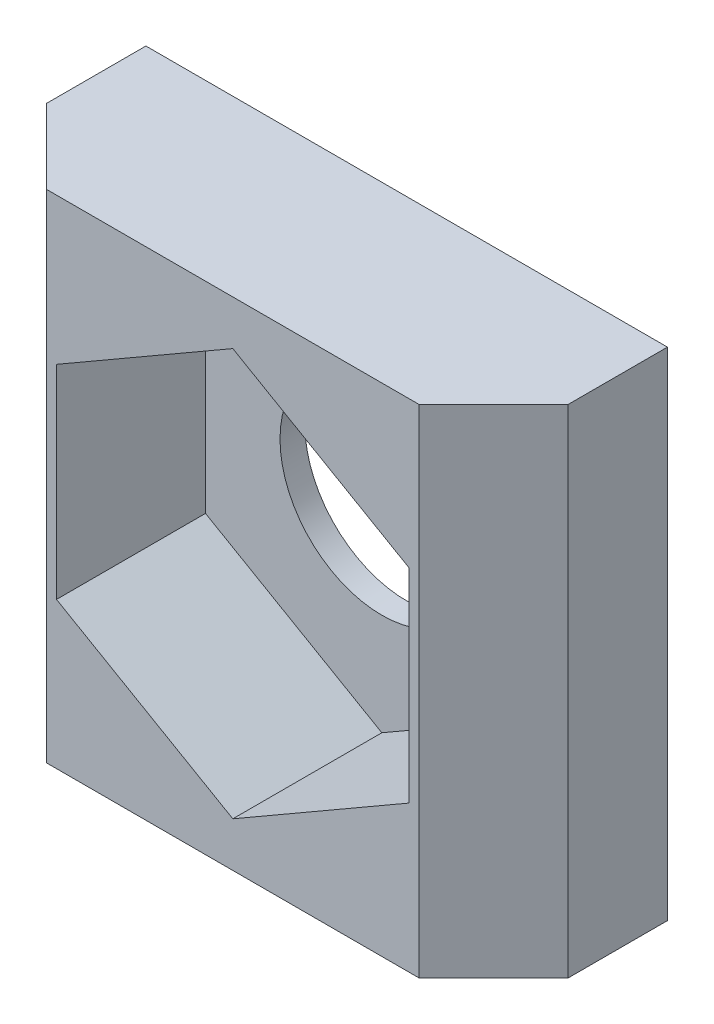
ISO-10303-21;
HEADER;
FILE_DESCRIPTION(('STEP AP214'),'2;1');
FILE_NAME('part.step','',(''),(''),'','','');
FILE_SCHEMA(('AUTOMOTIVE_DESIGN { 1 0 10303 214 1 1 1 1 }'));
ENDSEC;
DATA;
#1=APPLICATION_CONTEXT('core data for automotive mechanical design processes');
#2=APPLICATION_PROTOCOL_DEFINITION('international standard','automotive_design',2000,#1);
#3=PRODUCT_CONTEXT('',#1,'mechanical');
#4=PRODUCT('Part','Part','',(#3));
#5=PRODUCT_RELATED_PRODUCT_CATEGORY('part','',(#4));
#6=PRODUCT_DEFINITION_FORMATION('','',#4);
#7=PRODUCT_DEFINITION_CONTEXT('part definition',#1,'design');
#8=PRODUCT_DEFINITION('design','',#6,#7);
#9=PRODUCT_DEFINITION_SHAPE('','',#8);
#10=(LENGTH_UNIT() NAMED_UNIT(*) SI_UNIT(.MILLI.,.METRE.));
#11=(NAMED_UNIT(*) PLANE_ANGLE_UNIT() SI_UNIT($,.RADIAN.));
#12=(NAMED_UNIT(*) SI_UNIT($,.STERADIAN.) SOLID_ANGLE_UNIT());
#13=UNCERTAINTY_MEASURE_WITH_UNIT(LENGTH_MEASURE(1.E-05),#10,'distance_accuracy_value','');
#14=(GEOMETRIC_REPRESENTATION_CONTEXT(3) GLOBAL_UNCERTAINTY_ASSIGNED_CONTEXT((#13)) GLOBAL_UNIT_ASSIGNED_CONTEXT((#10,
#11,#12)) REPRESENTATION_CONTEXT('',''));
#15=CARTESIAN_POINT('',(0.,0.,0.));
#16=DIRECTION('',(0.,0.,1.));
#17=DIRECTION('',(1.,0.,0.));
#18=AXIS2_PLACEMENT_3D('',#15,#16,#17);
#19=CARTESIAN_POINT('',(5.25,10.,-1.5));
#20=DIRECTION('',(-1.,0.,0.));
#21=DIRECTION('',(0.,0.,1.));
#22=AXIS2_PLACEMENT_3D('',#19,#20,#21);
#23=PLANE('',#22);
#24=DIRECTION('',(0.,0.,-1.));
#25=VECTOR('',#24,1.);
#26=CARTESIAN_POINT('',(5.25,0.,-1.5));
#27=LINE('',#26,#25);
#28=CARTESIAN_POINT('',(5.25,0.,-1.5));
#29=VERTEX_POINT('',#28);
#30=CARTESIAN_POINT('',(5.25,0.,-3.5));
#31=VERTEX_POINT('',#30);
#32=EDGE_CURVE('E132',#29,#31,#27,.T.);
#33=ORIENTED_EDGE('',*,*,#32,.T.);
#34=DIRECTION('',(0.,-1.,0.));
#35=VECTOR('',#34,1.);
#36=CARTESIAN_POINT('',(5.25,10.,-3.5));
#37=LINE('',#36,#35);
#38=CARTESIAN_POINT('',(5.25,10.,-3.5));
#39=VERTEX_POINT('',#38);
#40=EDGE_CURVE('E11',#39,#31,#37,.T.);
#41=ORIENTED_EDGE('',*,*,#40,.F.);
#42=DIRECTION('',(0.,0.,-1.));
#43=VECTOR('',#42,1.);
#44=CARTESIAN_POINT('',(5.25,10.,-1.5));
#45=LINE('',#44,#43);
#46=CARTESIAN_POINT('',(5.25,10.,-1.5));
#47=VERTEX_POINT('',#46);
#48=EDGE_CURVE('E144',#47,#39,#45,.T.);
#49=ORIENTED_EDGE('',*,*,#48,.F.);
#50=DIRECTION('',(0.,-1.,0.));
#51=VECTOR('',#50,1.);
#52=CARTESIAN_POINT('',(5.25,10.,-1.5));
#53=LINE('',#52,#51);
#54=EDGE_CURVE('E128',#47,#29,#53,.T.);
#55=ORIENTED_EDGE('',*,*,#54,.T.);
#56=EDGE_LOOP('',(#33,#41,#49,#55));
#57=FACE_BOUND('',#56,.T.);
#58=ADVANCED_FACE('F35',(#57),#23,.F.);
#59=CARTESIAN_POINT('',(-5.25,10.,-3.5));
#60=DIRECTION('',(0.,0.,1.));
#61=DIRECTION('',(1.,0.,0.));
#62=AXIS2_PLACEMENT_3D('',#59,#60,#61);
#63=PLANE('',#62);
#64=CARTESIAN_POINT('',(0.,5.,-3.5));
#65=DIRECTION('',(0.,0.,-1.));
#66=DIRECTION('',(-1.,0.,0.));
#67=AXIS2_PLACEMENT_3D('',#64,#65,#66);
#68=CIRCLE('',#67,2.05);
#69=CARTESIAN_POINT('',(-2.05,5.,-3.5));
#70=VERTEX_POINT('',#69);
#71=EDGE_CURVE('E211',#70,#70,#68,.T.);
#72=ORIENTED_EDGE('',*,*,#71,.F.);
#73=EDGE_LOOP('',(#72));
#74=FACE_BOUND('',#73,.T.);
#75=DIRECTION('',(-1.,0.,0.));
#76=VECTOR('',#75,1.);
#77=CARTESIAN_POINT('',(-5.25,0.,-3.5));
#78=LINE('',#77,#76);
#79=CARTESIAN_POINT('',(-5.25,0.,-3.5));
#80=VERTEX_POINT('',#79);
#81=EDGE_CURVE('E135',#31,#80,#78,.T.);
#82=ORIENTED_EDGE('',*,*,#81,.T.);
#83=DIRECTION('',(0.,-1.,0.));
#84=VECTOR('',#83,1.);
#85=CARTESIAN_POINT('',(-5.25,10.,-3.5));
#86=LINE('',#85,#84);
#87=CARTESIAN_POINT('',(-5.25,10.,-3.5));
#88=VERTEX_POINT('',#87);
#89=EDGE_CURVE('E43',#88,#80,#86,.T.);
#90=ORIENTED_EDGE('',*,*,#89,.F.);
#91=DIRECTION('',(-1.,0.,0.));
#92=VECTOR('',#91,1.);
#93=CARTESIAN_POINT('',(-5.25,10.,-3.5));
#94=LINE('',#93,#92);
#95=EDGE_CURVE('E94',#39,#88,#94,.T.);
#96=ORIENTED_EDGE('',*,*,#95,.F.);
#97=ORIENTED_EDGE('',*,*,#40,.T.);
#98=EDGE_LOOP('',(#82,#90,#96,#97));
#99=FACE_BOUND('',#98,.T.);
#100=ADVANCED_FACE('F279',(#74,#99),#63,.F.);
#101=CARTESIAN_POINT('',(-5.25,10.,-1.5));
#102=DIRECTION('',(1.,0.,0.));
#103=DIRECTION('',(0.,0.,-1.));
#104=AXIS2_PLACEMENT_3D('',#101,#102,#103);
#105=PLANE('',#104);
#106=DIRECTION('',(0.,0.,1.));
#107=VECTOR('',#106,1.);
#108=CARTESIAN_POINT('',(-5.25,0.,-1.5));
#109=LINE('',#108,#107);
#110=CARTESIAN_POINT('',(-5.25,0.,-1.5));
#111=VERTEX_POINT('',#110);
#112=EDGE_CURVE('E138',#80,#111,#109,.T.);
#113=ORIENTED_EDGE('',*,*,#112,.T.);
#114=DIRECTION('',(0.,-1.,0.));
#115=VECTOR('',#114,1.);
#116=CARTESIAN_POINT('',(-5.25,10.,-1.5));
#117=LINE('',#116,#115);
#118=CARTESIAN_POINT('',(-5.25,10.,-1.5));
#119=VERTEX_POINT('',#118);
#120=EDGE_CURVE('E123',#119,#111,#117,.T.);
#121=ORIENTED_EDGE('',*,*,#120,.F.);
#122=DIRECTION('',(0.,0.,1.));
#123=VECTOR('',#122,1.);
#124=CARTESIAN_POINT('',(-5.25,10.,-1.5));
#125=LINE('',#124,#123);
#126=EDGE_CURVE('E111',#88,#119,#125,.T.);
#127=ORIENTED_EDGE('',*,*,#126,.F.);
#128=ORIENTED_EDGE('',*,*,#89,.T.);
#129=EDGE_LOOP('',(#113,#121,#127,#128));
#130=FACE_BOUND('',#129,.T.);
#131=ADVANCED_FACE('F151',(#130),#105,.F.);
#132=CARTESIAN_POINT('',(-3.75,10.,0.));
#133=DIRECTION('',(0.707106781186548,0.,-0.707106781186547));
#134=DIRECTION('',(-0.707106781186547,0.,-0.707106781186548));
#135=AXIS2_PLACEMENT_3D('',#132,#133,#134);
#136=PLANE('',#135);
#137=DIRECTION('',(0.707106781186547,0.,0.707106781186548));
#138=VECTOR('',#137,1.);
#139=CARTESIAN_POINT('',(-3.75,0.,0.));
#140=LINE('',#139,#138);
#141=CARTESIAN_POINT('',(-3.75,0.,0.));
#142=VERTEX_POINT('',#141);
#143=EDGE_CURVE('E120',#111,#142,#140,.T.);
#144=ORIENTED_EDGE('',*,*,#143,.T.);
#145=DIRECTION('',(0.,-1.,0.));
#146=VECTOR('',#145,1.);
#147=CARTESIAN_POINT('',(-3.75,10.,0.));
#148=LINE('',#147,#146);
#149=CARTESIAN_POINT('',(-3.75,10.,0.));
#150=VERTEX_POINT('',#149);
#151=EDGE_CURVE('E117',#150,#142,#148,.T.);
#152=ORIENTED_EDGE('',*,*,#151,.F.);
#153=DIRECTION('',(0.707106781186547,0.,0.707106781186548));
#154=VECTOR('',#153,1.);
#155=CARTESIAN_POINT('',(-3.75,10.,0.));
#156=LINE('',#155,#154);
#157=EDGE_CURVE('E104',#119,#150,#156,.T.);
#158=ORIENTED_EDGE('',*,*,#157,.F.);
#159=ORIENTED_EDGE('',*,*,#120,.T.);
#160=EDGE_LOOP('',(#144,#152,#158,#159));
#161=FACE_BOUND('',#160,.T.);
#162=ADVANCED_FACE('F118',(#161),#136,.F.);
#163=CARTESIAN_POINT('',(3.75,10.,0.));
#164=DIRECTION('',(0.,0.,-1.));
#165=DIRECTION('',(-1.,0.,0.));
#166=AXIS2_PLACEMENT_3D('',#163,#164,#165);
#167=PLANE('',#166);
#168=DIRECTION('',(-0.866025403784439,0.5,0.));
#169=VECTOR('',#168,1.);
#170=CARTESIAN_POINT('',(3.9400635094611,6.82439018343476,0.));
#171=LINE('',#170,#169);
#172=CARTESIAN_POINT('',(3.55,7.04959345562317,0.));
#173=VERTEX_POINT('',#172);
#174=CARTESIAN_POINT('',(0.,9.09918691124634,0.));
#175=VERTEX_POINT('',#174);
#176=EDGE_CURVE('E191',#173,#175,#171,.T.);
#177=ORIENTED_EDGE('',*,*,#176,.F.);
#178=DIRECTION('',(0.,1.,0.));
#179=VECTOR('',#178,1.);
#180=CARTESIAN_POINT('',(3.55,0.,0.));
#181=LINE('',#180,#179);
#182=CARTESIAN_POINT('',(3.55,2.95040654437683,0.));
#183=VERTEX_POINT('',#182);
#184=EDGE_CURVE('E50',#183,#173,#181,.T.);
#185=ORIENTED_EDGE('',*,*,#184,.F.);
#186=DIRECTION('',(0.866025403784439,0.5,0.));
#187=VECTOR('',#186,1.);
#188=CARTESIAN_POINT('',(-0.390063509461097,0.675609816565243,0.));
#189=LINE('',#188,#187);
#190=CARTESIAN_POINT('',(0.,0.900813088753658,0.));
#191=VERTEX_POINT('',#190);
#192=EDGE_CURVE('E178',#191,#183,#189,.T.);
#193=ORIENTED_EDGE('',*,*,#192,.F.);
#194=DIRECTION('',(0.866025403784439,-0.5,0.));
#195=VECTOR('',#194,1.);
#196=CARTESIAN_POINT('',(0.390063509461097,0.675609816565243,0.));
#197=LINE('',#196,#195);
#198=CARTESIAN_POINT('',(-3.55,2.95040654437683,0.));
#199=VERTEX_POINT('',#198);
#200=EDGE_CURVE('E182',#199,#191,#197,.T.);
#201=ORIENTED_EDGE('',*,*,#200,.F.);
#202=DIRECTION('',(0.,-1.,0.));
#203=VECTOR('',#202,1.);
#204=CARTESIAN_POINT('',(-3.55,0.,0.));
#205=LINE('',#204,#203);
#206=CARTESIAN_POINT('',(-3.55,7.04959345562317,0.));
#207=VERTEX_POINT('',#206);
#208=EDGE_CURVE('E185',#207,#199,#205,.T.);
#209=ORIENTED_EDGE('',*,*,#208,.F.);
#210=DIRECTION('',(-0.866025403784438,-0.5,0.));
#211=VECTOR('',#210,1.);
#212=CARTESIAN_POINT('',(-3.9400635094611,6.82439018343475,0.));
#213=LINE('',#212,#211);
#214=EDGE_CURVE('E188',#175,#207,#213,.T.);
#215=ORIENTED_EDGE('',*,*,#214,.F.);
#216=EDGE_LOOP('',(#177,#185,#193,#201,#209,#215));
#217=FACE_BOUND('',#216,.T.);
#218=DIRECTION('',(1.,0.,0.));
#219=VECTOR('',#218,1.);
#220=CARTESIAN_POINT('',(3.75,0.,0.));
#221=LINE('',#220,#219);
#222=CARTESIAN_POINT('',(3.75,0.,0.));
#223=VERTEX_POINT('',#222);
#224=EDGE_CURVE('E141',#142,#223,#221,.T.);
#225=ORIENTED_EDGE('',*,*,#224,.T.);
#226=DIRECTION('',(0.,-1.,0.));
#227=VECTOR('',#226,1.);
#228=CARTESIAN_POINT('',(3.75,10.,0.));
#229=LINE('',#228,#227);
#230=CARTESIAN_POINT('',(3.75,10.,0.));
#231=VERTEX_POINT('',#230);
#232=EDGE_CURVE('E124',#231,#223,#229,.T.);
#233=ORIENTED_EDGE('',*,*,#232,.F.);
#234=DIRECTION('',(1.,0.,0.));
#235=VECTOR('',#234,1.);
#236=CARTESIAN_POINT('',(3.75,10.,0.));
#237=LINE('',#236,#235);
#238=EDGE_CURVE('E108',#150,#231,#237,.T.);
#239=ORIENTED_EDGE('',*,*,#238,.F.);
#240=ORIENTED_EDGE('',*,*,#151,.T.);
#241=EDGE_LOOP('',(#225,#233,#239,#240));
#242=FACE_BOUND('',#241,.T.);
#243=ADVANCED_FACE('F126',(#217,#242),#167,.F.);
#244=CARTESIAN_POINT('',(3.75,10.,0.));
#245=DIRECTION('',(-0.707106781186548,0.,-0.707106781186547));
#246=DIRECTION('',(-0.707106781186547,0.,0.707106781186548));
#247=AXIS2_PLACEMENT_3D('',#244,#245,#246);
#248=PLANE('',#247);
#249=DIRECTION('',(0.707106781186547,0.,-0.707106781186548));
#250=VECTOR('',#249,1.);
#251=CARTESIAN_POINT('',(3.75,0.,0.));
#252=LINE('',#251,#250);
#253=EDGE_CURVE('E86',#223,#29,#252,.T.);
#254=ORIENTED_EDGE('',*,*,#253,.T.);
#255=ORIENTED_EDGE('',*,*,#54,.F.);
#256=DIRECTION('',(0.707106781186547,0.,-0.707106781186548));
#257=VECTOR('',#256,1.);
#258=CARTESIAN_POINT('',(3.75,10.,0.));
#259=LINE('',#258,#257);
#260=EDGE_CURVE('E59',#231,#47,#259,.T.);
#261=ORIENTED_EDGE('',*,*,#260,.F.);
#262=ORIENTED_EDGE('',*,*,#232,.T.);
#263=EDGE_LOOP('',(#254,#255,#261,#262));
#264=FACE_BOUND('',#263,.T.);
#265=ADVANCED_FACE('F155',(#264),#248,.F.);
#266=CARTESIAN_POINT('',(0.,10.,0.));
#267=DIRECTION('',(0.,-1.,0.));
#268=DIRECTION('',(0.,0.,-1.));
#269=AXIS2_PLACEMENT_3D('',#266,#267,#268);
#270=PLANE('',#269);
#271=ORIENTED_EDGE('',*,*,#48,.T.);
#272=ORIENTED_EDGE('',*,*,#95,.T.);
#273=ORIENTED_EDGE('',*,*,#126,.T.);
#274=ORIENTED_EDGE('',*,*,#157,.T.);
#275=ORIENTED_EDGE('',*,*,#238,.T.);
#276=ORIENTED_EDGE('',*,*,#260,.T.);
#277=EDGE_LOOP('',(#271,#272,#273,#274,#275,#276));
#278=FACE_BOUND('',#277,.T.);
#279=ADVANCED_FACE('F106',(#278),#270,.F.);
#280=CARTESIAN_POINT('',(0.,0.,0.));
#281=DIRECTION('',(0.,-1.,0.));
#282=DIRECTION('',(0.,0.,-1.));
#283=AXIS2_PLACEMENT_3D('',#280,#281,#282);
#284=PLANE('',#283);
#285=ORIENTED_EDGE('',*,*,#32,.F.);
#286=ORIENTED_EDGE('',*,*,#253,.F.);
#287=ORIENTED_EDGE('',*,*,#224,.F.);
#288=ORIENTED_EDGE('',*,*,#143,.F.);
#289=ORIENTED_EDGE('',*,*,#112,.F.);
#290=ORIENTED_EDGE('',*,*,#81,.F.);
#291=EDGE_LOOP('',(#285,#286,#287,#288,#289,#290));
#292=FACE_BOUND('',#291,.T.);
#293=ADVANCED_FACE('F154',(#292),#284,.T.);
#294=CARTESIAN_POINT('',(3.55,0.,-3.));
#295=DIRECTION('',(1.,0.,0.));
#296=DIRECTION('',(0.,1.,0.));
#297=AXIS2_PLACEMENT_3D('',#294,#295,#296);
#298=PLANE('',#297);
#299=ORIENTED_EDGE('',*,*,#184,.T.);
#300=DIRECTION('',(0.,0.,1.));
#301=VECTOR('',#300,1.);
#302=CARTESIAN_POINT('',(3.55,7.04959345562317,-3.));
#303=LINE('',#302,#301);
#304=CARTESIAN_POINT('',(3.55,7.04959345562317,-3.));
#305=VERTEX_POINT('',#304);
#306=EDGE_CURVE('E162',#305,#173,#303,.T.);
#307=ORIENTED_EDGE('',*,*,#306,.F.);
#308=DIRECTION('',(0.,1.,0.));
#309=VECTOR('',#308,1.);
#310=CARTESIAN_POINT('',(3.55,0.,-3.));
#311=LINE('',#310,#309);
#312=CARTESIAN_POINT('',(3.55,2.95040654437683,-3.));
#313=VERTEX_POINT('',#312);
#314=EDGE_CURVE('E181',#313,#305,#311,.T.);
#315=ORIENTED_EDGE('',*,*,#314,.F.);
#316=DIRECTION('',(0.,0.,1.));
#317=VECTOR('',#316,1.);
#318=CARTESIAN_POINT('',(3.55,2.95040654437683,-3.));
#319=LINE('',#318,#317);
#320=EDGE_CURVE('E136',#313,#183,#319,.T.);
#321=ORIENTED_EDGE('',*,*,#320,.T.);
#322=EDGE_LOOP('',(#299,#307,#315,#321));
#323=FACE_BOUND('',#322,.T.);
#324=ADVANCED_FACE('F231',(#323),#298,.F.);
#325=CARTESIAN_POINT('',(-0.390063509461097,0.675609816565243,-3.));
#326=DIRECTION('',(0.5,-0.866025403784438,0.));
#327=DIRECTION('',(0.866025403784439,0.5,0.));
#328=AXIS2_PLACEMENT_3D('',#325,#326,#327);
#329=PLANE('',#328);
#330=ORIENTED_EDGE('',*,*,#192,.T.);
#331=ORIENTED_EDGE('',*,*,#320,.F.);
#332=DIRECTION('',(0.866025403784439,0.5,0.));
#333=VECTOR('',#332,1.);
#334=CARTESIAN_POINT('',(-0.390063509461097,0.675609816565243,-3.));
#335=LINE('',#334,#333);
#336=CARTESIAN_POINT('',(0.,0.900813088753658,-3.));
#337=VERTEX_POINT('',#336);
#338=EDGE_CURVE('E165',#337,#313,#335,.T.);
#339=ORIENTED_EDGE('',*,*,#338,.F.);
#340=DIRECTION('',(0.,0.,1.));
#341=VECTOR('',#340,1.);
#342=CARTESIAN_POINT('',(0.,0.900813088753658,-3.));
#343=LINE('',#342,#341);
#344=EDGE_CURVE('E174',#337,#191,#343,.T.);
#345=ORIENTED_EDGE('',*,*,#344,.T.);
#346=EDGE_LOOP('',(#330,#331,#339,#345));
#347=FACE_BOUND('',#346,.T.);
#348=ADVANCED_FACE('F247',(#347),#329,.F.);
#349=CARTESIAN_POINT('',(0.390063509461097,0.675609816565243,-3.));
#350=DIRECTION('',(-0.5,-0.866025403784438,0.));
#351=DIRECTION('',(0.866025403784439,-0.5,0.));
#352=AXIS2_PLACEMENT_3D('',#349,#350,#351);
#353=PLANE('',#352);
#354=ORIENTED_EDGE('',*,*,#200,.T.);
#355=ORIENTED_EDGE('',*,*,#344,.F.);
#356=DIRECTION('',(0.866025403784439,-0.5,0.));
#357=VECTOR('',#356,1.);
#358=CARTESIAN_POINT('',(0.390063509461097,0.675609816565243,-3.));
#359=LINE('',#358,#357);
#360=CARTESIAN_POINT('',(-3.55,2.95040654437683,-3.));
#361=VERTEX_POINT('',#360);
#362=EDGE_CURVE('E197',#361,#337,#359,.T.);
#363=ORIENTED_EDGE('',*,*,#362,.F.);
#364=DIRECTION('',(0.,0.,1.));
#365=VECTOR('',#364,1.);
#366=CARTESIAN_POINT('',(-3.55,2.95040654437683,-3.));
#367=LINE('',#366,#365);
#368=EDGE_CURVE('E171',#361,#199,#367,.T.);
#369=ORIENTED_EDGE('',*,*,#368,.T.);
#370=EDGE_LOOP('',(#354,#355,#363,#369));
#371=FACE_BOUND('',#370,.T.);
#372=ADVANCED_FACE('F252',(#371),#353,.F.);
#373=CARTESIAN_POINT('',(-3.55,0.,-3.));
#374=DIRECTION('',(-1.,0.,0.));
#375=DIRECTION('',(0.,0.,1.));
#376=AXIS2_PLACEMENT_3D('',#373,#374,#375);
#377=PLANE('',#376);
#378=ORIENTED_EDGE('',*,*,#208,.T.);
#379=ORIENTED_EDGE('',*,*,#368,.F.);
#380=DIRECTION('',(0.,-1.,0.));
#381=VECTOR('',#380,1.);
#382=CARTESIAN_POINT('',(-3.55,0.,-3.));
#383=LINE('',#382,#381);
#384=CARTESIAN_POINT('',(-3.55,7.04959345562317,-3.));
#385=VERTEX_POINT('',#384);
#386=EDGE_CURVE('E200',#385,#361,#383,.T.);
#387=ORIENTED_EDGE('',*,*,#386,.F.);
#388=DIRECTION('',(0.,0.,1.));
#389=VECTOR('',#388,1.);
#390=CARTESIAN_POINT('',(-3.55,7.04959345562317,-3.));
#391=LINE('',#390,#389);
#392=EDGE_CURVE('E168',#385,#207,#391,.T.);
#393=ORIENTED_EDGE('',*,*,#392,.T.);
#394=EDGE_LOOP('',(#378,#379,#387,#393));
#395=FACE_BOUND('',#394,.T.);
#396=ADVANCED_FACE('F269',(#395),#377,.F.);
#397=CARTESIAN_POINT('',(-3.9400635094611,6.82439018343475,-3.));
#398=DIRECTION('',(-0.5,0.866025403784438,0.));
#399=DIRECTION('',(-0.866025403784438,-0.5,0.));
#400=AXIS2_PLACEMENT_3D('',#397,#398,#399);
#401=PLANE('',#400);
#402=ORIENTED_EDGE('',*,*,#214,.T.);
#403=ORIENTED_EDGE('',*,*,#392,.F.);
#404=DIRECTION('',(-0.866025403784438,-0.5,0.));
#405=VECTOR('',#404,1.);
#406=CARTESIAN_POINT('',(-3.9400635094611,6.82439018343475,-3.));
#407=LINE('',#406,#405);
#408=CARTESIAN_POINT('',(0.,9.09918691124634,-3.));
#409=VERTEX_POINT('',#408);
#410=EDGE_CURVE('E203',#409,#385,#407,.T.);
#411=ORIENTED_EDGE('',*,*,#410,.F.);
#412=DIRECTION('',(0.,0.,1.));
#413=VECTOR('',#412,1.);
#414=CARTESIAN_POINT('',(0.,9.09918691124634,-3.));
#415=LINE('',#414,#413);
#416=EDGE_CURVE('E164',#409,#175,#415,.T.);
#417=ORIENTED_EDGE('',*,*,#416,.T.);
#418=EDGE_LOOP('',(#402,#403,#411,#417));
#419=FACE_BOUND('',#418,.T.);
#420=ADVANCED_FACE('F265',(#419),#401,.F.);
#421=CARTESIAN_POINT('',(3.9400635094611,6.82439018343476,-3.));
#422=DIRECTION('',(0.5,0.866025403784438,0.));
#423=DIRECTION('',(-0.866025403784439,0.5,0.));
#424=AXIS2_PLACEMENT_3D('',#421,#422,#423);
#425=PLANE('',#424);
#426=ORIENTED_EDGE('',*,*,#176,.T.);
#427=ORIENTED_EDGE('',*,*,#416,.F.);
#428=DIRECTION('',(-0.866025403784439,0.5,0.));
#429=VECTOR('',#428,1.);
#430=CARTESIAN_POINT('',(3.9400635094611,6.82439018343476,-3.));
#431=LINE('',#430,#429);
#432=EDGE_CURVE('E206',#305,#409,#431,.T.);
#433=ORIENTED_EDGE('',*,*,#432,.F.);
#434=ORIENTED_EDGE('',*,*,#306,.T.);
#435=EDGE_LOOP('',(#426,#427,#433,#434));
#436=FACE_BOUND('',#435,.T.);
#437=ADVANCED_FACE('F223',(#436),#425,.F.);
#438=CARTESIAN_POINT('',(0.,0.,-3.));
#439=DIRECTION('',(0.,0.,1.));
#440=DIRECTION('',(1.,0.,0.));
#441=AXIS2_PLACEMENT_3D('',#438,#439,#440);
#442=PLANE('',#441);
#443=CARTESIAN_POINT('',(0.,5.,-3.));
#444=DIRECTION('',(0.,0.,1.));
#445=DIRECTION('',(1.,0.,0.));
#446=AXIS2_PLACEMENT_3D('',#443,#444,#445);
#447=CIRCLE('',#446,2.05);
#448=CARTESIAN_POINT('',(2.05,5.,-3.));
#449=VERTEX_POINT('',#448);
#450=EDGE_CURVE('E38',#449,#449,#447,.T.);
#451=ORIENTED_EDGE('',*,*,#450,.F.);
#452=EDGE_LOOP('',(#451));
#453=FACE_BOUND('',#452,.T.);
#454=ORIENTED_EDGE('',*,*,#314,.T.);
#455=ORIENTED_EDGE('',*,*,#432,.T.);
#456=ORIENTED_EDGE('',*,*,#410,.T.);
#457=ORIENTED_EDGE('',*,*,#386,.T.);
#458=ORIENTED_EDGE('',*,*,#362,.T.);
#459=ORIENTED_EDGE('',*,*,#338,.T.);
#460=EDGE_LOOP('',(#454,#455,#456,#457,#458,#459));
#461=FACE_BOUND('',#460,.T.);
#462=ADVANCED_FACE('F220',(#453,#461),#442,.T.);
#463=CARTESIAN_POINT('',(0.,5.,0.));
#464=DIRECTION('',(0.,0.,-1.));
#465=DIRECTION('',(-1.,0.,0.));
#466=AXIS2_PLACEMENT_3D('',#463,#464,#465);
#467=CYLINDRICAL_SURFACE('',#466,2.05);
#468=ORIENTED_EDGE('',*,*,#450,.T.);
#469=EDGE_LOOP('',(#468));
#470=FACE_BOUND('',#469,.T.);
#471=ORIENTED_EDGE('',*,*,#71,.T.);
#472=EDGE_LOOP('',(#471));
#473=FACE_BOUND('',#472,.T.);
#474=ADVANCED_FACE('F218',(#470,#473),#467,.F.);
#475=CLOSED_SHELL('',(#58,#100,#131,#162,#243,#265,#279,#293,#324,#348,#372,#396,#420,#437,#462,#474));
#476=MANIFOLD_SOLID_BREP('B2',#475);
#477=ADVANCED_BREP_SHAPE_REPRESENTATION('',(#18,#476),#14);
#478=SHAPE_DEFINITION_REPRESENTATION(#9,#477);
ENDSEC;
END-ISO-10303-21;
